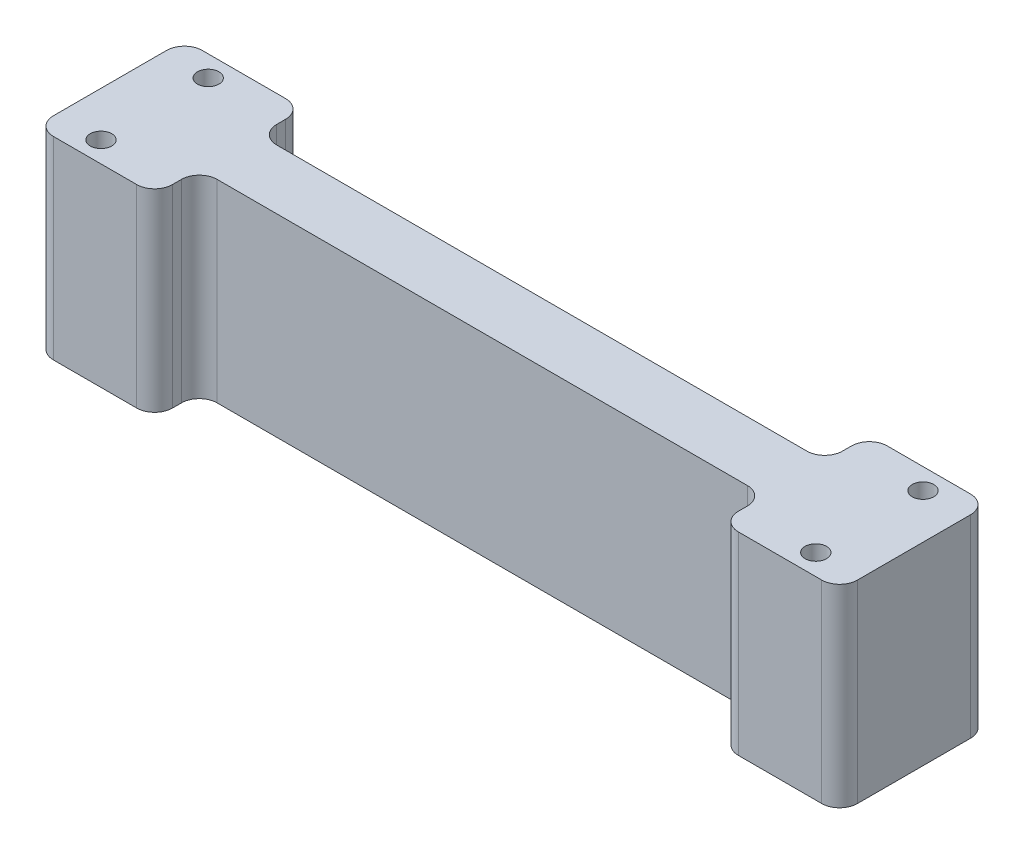
ISO-10303-21;
HEADER;
FILE_DESCRIPTION(('STEP AP214'),'2;1');
FILE_NAME('part.step','',(''),(''),'','','');
FILE_SCHEMA(('AUTOMOTIVE_DESIGN { 1 0 10303 214 1 1 1 1 }'));
ENDSEC;
DATA;
#1=APPLICATION_CONTEXT('core data for automotive mechanical design processes');
#2=APPLICATION_PROTOCOL_DEFINITION('international standard','automotive_design',2000,#1);
#3=PRODUCT_CONTEXT('',#1,'mechanical');
#4=PRODUCT('Part','Part','',(#3));
#5=PRODUCT_RELATED_PRODUCT_CATEGORY('part','',(#4));
#6=PRODUCT_DEFINITION_FORMATION('','',#4);
#7=PRODUCT_DEFINITION_CONTEXT('part definition',#1,'design');
#8=PRODUCT_DEFINITION('design','',#6,#7);
#9=PRODUCT_DEFINITION_SHAPE('','',#8);
#10=(LENGTH_UNIT() NAMED_UNIT(*) SI_UNIT(.MILLI.,.METRE.));
#11=(NAMED_UNIT(*) PLANE_ANGLE_UNIT() SI_UNIT($,.RADIAN.));
#12=(NAMED_UNIT(*) SI_UNIT($,.STERADIAN.) SOLID_ANGLE_UNIT());
#13=UNCERTAINTY_MEASURE_WITH_UNIT(LENGTH_MEASURE(1.E-05),#10,'distance_accuracy_value','');
#14=(GEOMETRIC_REPRESENTATION_CONTEXT(3) GLOBAL_UNCERTAINTY_ASSIGNED_CONTEXT((#13)) GLOBAL_UNIT_ASSIGNED_CONTEXT((#10,
#11,#12)) REPRESENTATION_CONTEXT('',''));
#15=CARTESIAN_POINT('',(0.,0.,0.));
#16=DIRECTION('',(0.,0.,1.));
#17=DIRECTION('',(1.,0.,0.));
#18=AXIS2_PLACEMENT_3D('',#15,#16,#17);
#19=CARTESIAN_POINT('',(47.5,32.5,0.));
#20=DIRECTION('',(-1.,0.,0.));
#21=DIRECTION('',(0.,0.,1.));
#22=AXIS2_PLACEMENT_3D('',#19,#20,#21);
#23=PLANE('',#22);
#24=DIRECTION('',(0.,0.,-1.));
#25=VECTOR('',#24,1.);
#26=CARTESIAN_POINT('',(47.5,0.,0.));
#27=LINE('',#26,#25);
#28=CARTESIAN_POINT('',(47.5,0.,-8.00000000000001));
#29=VERTEX_POINT('',#28);
#30=CARTESIAN_POINT('',(47.5,0.,-9.5));
#31=VERTEX_POINT('',#30);
#32=EDGE_CURVE('E231',#29,#31,#27,.T.);
#33=ORIENTED_EDGE('',*,*,#32,.F.);
#34=DIRECTION('',(0.,-1.,0.));
#35=VECTOR('',#34,1.);
#36=CARTESIAN_POINT('',(47.5,32.5,-8.00000000000001));
#37=LINE('',#36,#35);
#38=CARTESIAN_POINT('',(47.5,32.5,-8.00000000000001));
#39=VERTEX_POINT('',#38);
#40=EDGE_CURVE('E252',#29,#39,#37,.F.);
#41=ORIENTED_EDGE('',*,*,#40,.T.);
#42=DIRECTION('',(0.,0.,-1.));
#43=VECTOR('',#42,1.);
#44=CARTESIAN_POINT('',(47.5,32.5,0.));
#45=LINE('',#44,#43);
#46=CARTESIAN_POINT('',(47.5,32.5,-9.5));
#47=VERTEX_POINT('',#46);
#48=EDGE_CURVE('E498',#39,#47,#45,.T.);
#49=ORIENTED_EDGE('',*,*,#48,.T.);
#50=DIRECTION('',(0.,-1.,0.));
#51=VECTOR('',#50,1.);
#52=CARTESIAN_POINT('',(47.5,32.5,-9.5));
#53=LINE('',#52,#51);
#54=EDGE_CURVE('E239',#47,#31,#53,.T.);
#55=ORIENTED_EDGE('',*,*,#54,.T.);
#56=EDGE_LOOP('',(#33,#41,#49,#55));
#57=FACE_BOUND('',#56,.T.);
#58=ADVANCED_FACE('F50',(#57),#23,.T.);
#59=CARTESIAN_POINT('',(0.,32.5,-5.));
#60=DIRECTION('',(0.,0.,-1.));
#61=DIRECTION('',(-1.,0.,0.));
#62=AXIS2_PLACEMENT_3D('',#59,#60,#61);
#63=PLANE('',#62);
#64=DIRECTION('',(1.,0.,0.));
#65=VECTOR('',#64,1.);
#66=CARTESIAN_POINT('',(0.,32.5,-5.));
#67=LINE('',#66,#65);
#68=CARTESIAN_POINT('',(-44.5,32.5,-5.));
#69=VERTEX_POINT('',#68);
#70=CARTESIAN_POINT('',(44.5,32.5,-5.00000000000001));
#71=VERTEX_POINT('',#70);
#72=EDGE_CURVE('E500',#69,#71,#67,.T.);
#73=ORIENTED_EDGE('',*,*,#72,.T.);
#74=DIRECTION('',(0.,-1.,0.));
#75=VECTOR('',#74,1.);
#76=CARTESIAN_POINT('',(44.5,0.,-5.00000000000001));
#77=LINE('',#76,#75);
#78=CARTESIAN_POINT('',(44.5,0.,-5.00000000000001));
#79=VERTEX_POINT('',#78);
#80=EDGE_CURVE('E228',#71,#79,#77,.T.);
#81=ORIENTED_EDGE('',*,*,#80,.T.);
#82=DIRECTION('',(1.,0.,0.));
#83=VECTOR('',#82,1.);
#84=CARTESIAN_POINT('',(0.,0.,-5.));
#85=LINE('',#84,#83);
#86=CARTESIAN_POINT('',(-44.5,0.,-5.));
#87=VERTEX_POINT('',#86);
#88=EDGE_CURVE('E213',#87,#79,#85,.T.);
#89=ORIENTED_EDGE('',*,*,#88,.F.);
#90=DIRECTION('',(0.,-1.,0.));
#91=VECTOR('',#90,1.);
#92=CARTESIAN_POINT('',(-44.5,32.5,-5.));
#93=LINE('',#92,#91);
#94=EDGE_CURVE('E226',#87,#69,#93,.F.);
#95=ORIENTED_EDGE('',*,*,#94,.T.);
#96=EDGE_LOOP('',(#73,#81,#89,#95));
#97=FACE_BOUND('',#96,.T.);
#98=ADVANCED_FACE('F223',(#97),#63,.T.);
#99=CARTESIAN_POINT('',(-47.5,32.5,0.));
#100=DIRECTION('',(1.,0.,0.));
#101=DIRECTION('',(0.,0.,-1.));
#102=AXIS2_PLACEMENT_3D('',#99,#100,#101);
#103=PLANE('',#102);
#104=DIRECTION('',(0.,0.,1.));
#105=VECTOR('',#104,1.);
#106=CARTESIAN_POINT('',(-47.5,0.,0.));
#107=LINE('',#106,#105);
#108=CARTESIAN_POINT('',(-47.5,0.,-9.5));
#109=VERTEX_POINT('',#108);
#110=CARTESIAN_POINT('',(-47.5,0.,-7.99999999999999));
#111=VERTEX_POINT('',#110);
#112=EDGE_CURVE('E214',#109,#111,#107,.T.);
#113=ORIENTED_EDGE('',*,*,#112,.F.);
#114=DIRECTION('',(0.,-1.,0.));
#115=VECTOR('',#114,1.);
#116=CARTESIAN_POINT('',(-47.5,32.5,-9.5));
#117=LINE('',#116,#115);
#118=CARTESIAN_POINT('',(-47.5,32.5,-9.5));
#119=VERTEX_POINT('',#118);
#120=EDGE_CURVE('E370',#109,#119,#117,.F.);
#121=ORIENTED_EDGE('',*,*,#120,.T.);
#122=DIRECTION('',(0.,0.,1.));
#123=VECTOR('',#122,1.);
#124=CARTESIAN_POINT('',(-47.5,32.5,0.));
#125=LINE('',#124,#123);
#126=CARTESIAN_POINT('',(-47.5,32.5,-7.99999999999999));
#127=VERTEX_POINT('',#126);
#128=EDGE_CURVE('E492',#119,#127,#125,.T.);
#129=ORIENTED_EDGE('',*,*,#128,.T.);
#130=DIRECTION('',(0.,-1.,0.));
#131=VECTOR('',#130,1.);
#132=CARTESIAN_POINT('',(-47.5,0.,-7.99999999999999));
#133=LINE('',#132,#131);
#134=EDGE_CURVE('E365',#127,#111,#133,.T.);
#135=ORIENTED_EDGE('',*,*,#134,.T.);
#136=EDGE_LOOP('',(#113,#121,#129,#135));
#137=FACE_BOUND('',#136,.T.);
#138=ADVANCED_FACE('F553',(#137),#103,.T.);
#139=CARTESIAN_POINT('',(0.,32.5,-12.5));
#140=DIRECTION('',(0.,0.,-1.));
#141=DIRECTION('',(-1.,0.,0.));
#142=AXIS2_PLACEMENT_3D('',#139,#140,#141);
#143=PLANE('',#142);
#144=DIRECTION('',(1.,0.,0.));
#145=VECTOR('',#144,1.);
#146=CARTESIAN_POINT('',(0.,0.,-12.5));
#147=LINE('',#146,#145);
#148=CARTESIAN_POINT('',(-64.5,0.,-12.5));
#149=VERTEX_POINT('',#148);
#150=CARTESIAN_POINT('',(-50.5,0.,-12.5));
#151=VERTEX_POINT('',#150);
#152=EDGE_CURVE('E441',#149,#151,#147,.T.);
#153=ORIENTED_EDGE('',*,*,#152,.F.);
#154=DIRECTION('',(0.,-1.,0.));
#155=VECTOR('',#154,1.);
#156=CARTESIAN_POINT('',(-64.5,32.5,-12.5));
#157=LINE('',#156,#155);
#158=CARTESIAN_POINT('',(-64.5,32.5,-12.5));
#159=VERTEX_POINT('',#158);
#160=EDGE_CURVE('E353',#149,#159,#157,.F.);
#161=ORIENTED_EDGE('',*,*,#160,.T.);
#162=DIRECTION('',(1.,0.,0.));
#163=VECTOR('',#162,1.);
#164=CARTESIAN_POINT('',(0.,32.5,-12.5));
#165=LINE('',#164,#163);
#166=CARTESIAN_POINT('',(-50.5,32.5,-12.5));
#167=VERTEX_POINT('',#166);
#168=EDGE_CURVE('E243',#159,#167,#165,.T.);
#169=ORIENTED_EDGE('',*,*,#168,.T.);
#170=DIRECTION('',(0.,-1.,0.));
#171=VECTOR('',#170,1.);
#172=CARTESIAN_POINT('',(-50.5,32.5,-12.5));
#173=LINE('',#172,#171);
#174=EDGE_CURVE('E348',#167,#151,#173,.T.);
#175=ORIENTED_EDGE('',*,*,#174,.T.);
#176=EDGE_LOOP('',(#153,#161,#169,#175));
#177=FACE_BOUND('',#176,.T.);
#178=ADVANCED_FACE('F614',(#177),#143,.T.);
#179=CARTESIAN_POINT('',(-67.5,32.5,0.));
#180=DIRECTION('',(-1.,0.,0.));
#181=DIRECTION('',(0.,0.,1.));
#182=AXIS2_PLACEMENT_3D('',#179,#180,#181);
#183=PLANE('',#182);
#184=DIRECTION('',(0.,0.,-1.));
#185=VECTOR('',#184,1.);
#186=CARTESIAN_POINT('',(-67.5,0.,0.));
#187=LINE('',#186,#185);
#188=CARTESIAN_POINT('',(-67.5,0.,9.5));
#189=VERTEX_POINT('',#188);
#190=CARTESIAN_POINT('',(-67.5,0.,-9.5));
#191=VERTEX_POINT('',#190);
#192=EDGE_CURVE('E421',#189,#191,#187,.T.);
#193=ORIENTED_EDGE('',*,*,#192,.F.);
#194=DIRECTION('',(0.,-1.,0.));
#195=VECTOR('',#194,1.);
#196=CARTESIAN_POINT('',(-67.5,32.5,9.5));
#197=LINE('',#196,#195);
#198=CARTESIAN_POINT('',(-67.5,32.5,9.5));
#199=VERTEX_POINT('',#198);
#200=EDGE_CURVE('E350',#189,#199,#197,.F.);
#201=ORIENTED_EDGE('',*,*,#200,.T.);
#202=DIRECTION('',(0.,0.,-1.));
#203=VECTOR('',#202,1.);
#204=CARTESIAN_POINT('',(-67.5,32.5,0.));
#205=LINE('',#204,#203);
#206=CARTESIAN_POINT('',(-67.5,32.5,-9.5));
#207=VERTEX_POINT('',#206);
#208=EDGE_CURVE('E490',#199,#207,#205,.T.);
#209=ORIENTED_EDGE('',*,*,#208,.T.);
#210=DIRECTION('',(0.,-1.,0.));
#211=VECTOR('',#210,1.);
#212=CARTESIAN_POINT('',(-67.5,32.5,-9.5));
#213=LINE('',#212,#211);
#214=EDGE_CURVE('E342',#207,#191,#213,.T.);
#215=ORIENTED_EDGE('',*,*,#214,.T.);
#216=EDGE_LOOP('',(#193,#201,#209,#215));
#217=FACE_BOUND('',#216,.T.);
#218=ADVANCED_FACE('F619',(#217),#183,.T.);
#219=CARTESIAN_POINT('',(0.,32.5,12.5));
#220=DIRECTION('',(0.,0.,-1.));
#221=DIRECTION('',(-1.,0.,0.));
#222=AXIS2_PLACEMENT_3D('',#219,#220,#221);
#223=PLANE('',#222);
#224=DIRECTION('',(1.,0.,0.));
#225=VECTOR('',#224,1.);
#226=CARTESIAN_POINT('',(0.,32.5,12.5));
#227=LINE('',#226,#225);
#228=CARTESIAN_POINT('',(-64.5,32.5,12.5));
#229=VERTEX_POINT('',#228);
#230=CARTESIAN_POINT('',(-50.5,32.5,12.5));
#231=VERTEX_POINT('',#230);
#232=EDGE_CURVE('E482',#229,#231,#227,.T.);
#233=ORIENTED_EDGE('',*,*,#232,.F.);
#234=DIRECTION('',(0.,-1.,0.));
#235=VECTOR('',#234,1.);
#236=CARTESIAN_POINT('',(-64.5,0.,12.5));
#237=LINE('',#236,#235);
#238=CARTESIAN_POINT('',(-64.5,0.,12.5));
#239=VERTEX_POINT('',#238);
#240=EDGE_CURVE('E338',#229,#239,#237,.T.);
#241=ORIENTED_EDGE('',*,*,#240,.T.);
#242=DIRECTION('',(1.,0.,0.));
#243=VECTOR('',#242,1.);
#244=CARTESIAN_POINT('',(0.,0.,12.5));
#245=LINE('',#244,#243);
#246=CARTESIAN_POINT('',(-50.5,0.,12.5));
#247=VERTEX_POINT('',#246);
#248=EDGE_CURVE('E418',#239,#247,#245,.T.);
#249=ORIENTED_EDGE('',*,*,#248,.T.);
#250=DIRECTION('',(0.,-1.,0.));
#251=VECTOR('',#250,1.);
#252=CARTESIAN_POINT('',(-50.5,32.5,12.5));
#253=LINE('',#252,#251);
#254=EDGE_CURVE('E336',#247,#231,#253,.F.);
#255=ORIENTED_EDGE('',*,*,#254,.T.);
#256=EDGE_LOOP('',(#233,#241,#249,#255));
#257=FACE_BOUND('',#256,.T.);
#258=ADVANCED_FACE('F627',(#257),#223,.F.);
#259=CARTESIAN_POINT('',(-47.5,32.5,0.));
#260=DIRECTION('',(-1.,0.,0.));
#261=DIRECTION('',(0.,0.,1.));
#262=AXIS2_PLACEMENT_3D('',#259,#260,#261);
#263=PLANE('',#262);
#264=DIRECTION('',(0.,0.,-1.));
#265=VECTOR('',#264,1.);
#266=CARTESIAN_POINT('',(-47.5,32.5,0.));
#267=LINE('',#266,#265);
#268=CARTESIAN_POINT('',(-47.5,32.5,9.5));
#269=VERTEX_POINT('',#268);
#270=CARTESIAN_POINT('',(-47.5,32.5,8.00000000000001));
#271=VERTEX_POINT('',#270);
#272=EDGE_CURVE('E395',#269,#271,#267,.T.);
#273=ORIENTED_EDGE('',*,*,#272,.F.);
#274=DIRECTION('',(0.,-1.,0.));
#275=VECTOR('',#274,1.);
#276=CARTESIAN_POINT('',(-47.5,32.5,9.5));
#277=LINE('',#276,#275);
#278=CARTESIAN_POINT('',(-47.5,0.,9.5));
#279=VERTEX_POINT('',#278);
#280=EDGE_CURVE('E359',#269,#279,#277,.T.);
#281=ORIENTED_EDGE('',*,*,#280,.T.);
#282=DIRECTION('',(0.,0.,-1.));
#283=VECTOR('',#282,1.);
#284=CARTESIAN_POINT('',(-47.5,0.,0.));
#285=LINE('',#284,#283);
#286=CARTESIAN_POINT('',(-47.5,0.,8.00000000000001));
#287=VERTEX_POINT('',#286);
#288=EDGE_CURVE('E410',#279,#287,#285,.T.);
#289=ORIENTED_EDGE('',*,*,#288,.T.);
#290=DIRECTION('',(0.,-1.,0.));
#291=VECTOR('',#290,1.);
#292=CARTESIAN_POINT('',(-47.5,32.5,8.00000000000001));
#293=LINE('',#292,#291);
#294=EDGE_CURVE('E360',#287,#271,#293,.F.);
#295=ORIENTED_EDGE('',*,*,#294,.T.);
#296=EDGE_LOOP('',(#273,#281,#289,#295));
#297=FACE_BOUND('',#296,.T.);
#298=ADVANCED_FACE('F412',(#297),#263,.F.);
#299=CARTESIAN_POINT('',(0.,32.5,5.));
#300=DIRECTION('',(0.,0.,-1.));
#301=DIRECTION('',(-1.,0.,0.));
#302=AXIS2_PLACEMENT_3D('',#299,#300,#301);
#303=PLANE('',#302);
#304=DIRECTION('',(1.,0.,0.));
#305=VECTOR('',#304,1.);
#306=CARTESIAN_POINT('',(0.,0.,5.));
#307=LINE('',#306,#305);
#308=CARTESIAN_POINT('',(-44.5,0.,5.));
#309=VERTEX_POINT('',#308);
#310=CARTESIAN_POINT('',(44.5,0.,4.99999999999999));
#311=VERTEX_POINT('',#310);
#312=EDGE_CURVE('E411',#309,#311,#307,.T.);
#313=ORIENTED_EDGE('',*,*,#312,.T.);
#314=DIRECTION('',(0.,-1.,0.));
#315=VECTOR('',#314,1.);
#316=CARTESIAN_POINT('',(44.5,32.5,4.99999999999999));
#317=LINE('',#316,#315);
#318=CARTESIAN_POINT('',(44.5,32.5,4.99999999999999));
#319=VERTEX_POINT('',#318);
#320=EDGE_CURVE('E334',#311,#319,#317,.F.);
#321=ORIENTED_EDGE('',*,*,#320,.T.);
#322=DIRECTION('',(1.,0.,0.));
#323=VECTOR('',#322,1.);
#324=CARTESIAN_POINT('',(0.,32.5,5.));
#325=LINE('',#324,#323);
#326=CARTESIAN_POINT('',(-44.5,32.5,5.));
#327=VERTEX_POINT('',#326);
#328=EDGE_CURVE('E392',#327,#319,#325,.T.);
#329=ORIENTED_EDGE('',*,*,#328,.F.);
#330=DIRECTION('',(0.,-1.,0.));
#331=VECTOR('',#330,1.);
#332=CARTESIAN_POINT('',(-44.5,0.,5.));
#333=LINE('',#332,#331);
#334=EDGE_CURVE('E328',#327,#309,#333,.T.);
#335=ORIENTED_EDGE('',*,*,#334,.T.);
#336=EDGE_LOOP('',(#313,#321,#329,#335));
#337=FACE_BOUND('',#336,.T.);
#338=ADVANCED_FACE('F402',(#337),#303,.F.);
#339=CARTESIAN_POINT('',(47.5,32.5,0.));
#340=DIRECTION('',(1.,0.,0.));
#341=DIRECTION('',(0.,0.,-1.));
#342=AXIS2_PLACEMENT_3D('',#339,#340,#341);
#343=PLANE('',#342);
#344=DIRECTION('',(0.,0.,1.));
#345=VECTOR('',#344,1.);
#346=CARTESIAN_POINT('',(47.5,0.,0.));
#347=LINE('',#346,#345);
#348=CARTESIAN_POINT('',(47.5,0.,7.99999999999999));
#349=VERTEX_POINT('',#348);
#350=CARTESIAN_POINT('',(47.5,0.,9.5));
#351=VERTEX_POINT('',#350);
#352=EDGE_CURVE('E419',#349,#351,#347,.T.);
#353=ORIENTED_EDGE('',*,*,#352,.T.);
#354=DIRECTION('',(0.,-1.,0.));
#355=VECTOR('',#354,1.);
#356=CARTESIAN_POINT('',(47.5,32.5,9.5));
#357=LINE('',#356,#355);
#358=CARTESIAN_POINT('',(47.5,32.5,9.5));
#359=VERTEX_POINT('',#358);
#360=EDGE_CURVE('E326',#351,#359,#357,.F.);
#361=ORIENTED_EDGE('',*,*,#360,.T.);
#362=DIRECTION('',(0.,0.,1.));
#363=VECTOR('',#362,1.);
#364=CARTESIAN_POINT('',(47.5,32.5,0.));
#365=LINE('',#364,#363);
#366=CARTESIAN_POINT('',(47.5,32.5,7.99999999999999));
#367=VERTEX_POINT('',#366);
#368=EDGE_CURVE('E403',#367,#359,#365,.T.);
#369=ORIENTED_EDGE('',*,*,#368,.F.);
#370=DIRECTION('',(0.,-1.,0.));
#371=VECTOR('',#370,1.);
#372=CARTESIAN_POINT('',(47.5,0.,7.99999999999999));
#373=LINE('',#372,#371);
#374=EDGE_CURVE('E325',#367,#349,#373,.T.);
#375=ORIENTED_EDGE('',*,*,#374,.T.);
#376=EDGE_LOOP('',(#353,#361,#369,#375));
#377=FACE_BOUND('',#376,.T.);
#378=ADVANCED_FACE('F641',(#377),#343,.F.);
#379=CARTESIAN_POINT('',(50.5,0.,12.5));
#380=VERTEX_POINT('',#379);
#381=CARTESIAN_POINT('',(64.5,0.,12.5));
#382=VERTEX_POINT('',#381);
#383=EDGE_CURVE('E422',#380,#382,#245,.T.);
#384=ORIENTED_EDGE('',*,*,#383,.T.);
#385=DIRECTION('',(0.,-1.,0.));
#386=VECTOR('',#385,1.);
#387=CARTESIAN_POINT('',(64.5,32.5,12.5));
#388=LINE('',#387,#386);
#389=CARTESIAN_POINT('',(64.5,32.5,12.5));
#390=VERTEX_POINT('',#389);
#391=EDGE_CURVE('E317',#382,#390,#388,.F.);
#392=ORIENTED_EDGE('',*,*,#391,.T.);
#393=CARTESIAN_POINT('',(50.5,32.5,12.5));
#394=VERTEX_POINT('',#393);
#395=EDGE_CURVE('E476',#394,#390,#227,.T.);
#396=ORIENTED_EDGE('',*,*,#395,.F.);
#397=DIRECTION('',(0.,-1.,0.));
#398=VECTOR('',#397,1.);
#399=CARTESIAN_POINT('',(50.5,32.5,12.5));
#400=LINE('',#399,#398);
#401=EDGE_CURVE('E312',#394,#380,#400,.T.);
#402=ORIENTED_EDGE('',*,*,#401,.T.);
#403=EDGE_LOOP('',(#384,#392,#396,#402));
#404=FACE_BOUND('',#403,.T.);
#405=ADVANCED_FACE('F632',(#404),#223,.F.);
#406=CARTESIAN_POINT('',(67.5,32.5,0.));
#407=DIRECTION('',(-1.,0.,0.));
#408=DIRECTION('',(0.,0.,1.));
#409=AXIS2_PLACEMENT_3D('',#406,#407,#408);
#410=PLANE('',#409);
#411=DIRECTION('',(0.,0.,-1.));
#412=VECTOR('',#411,1.);
#413=CARTESIAN_POINT('',(67.5,0.,0.));
#414=LINE('',#413,#412);
#415=CARTESIAN_POINT('',(67.5,0.,9.5));
#416=VERTEX_POINT('',#415);
#417=CARTESIAN_POINT('',(67.5,0.,-9.5));
#418=VERTEX_POINT('',#417);
#419=EDGE_CURVE('E246',#416,#418,#414,.T.);
#420=ORIENTED_EDGE('',*,*,#419,.T.);
#421=DIRECTION('',(0.,-1.,0.));
#422=VECTOR('',#421,1.);
#423=CARTESIAN_POINT('',(67.5,32.5,-9.5));
#424=LINE('',#423,#422);
#425=CARTESIAN_POINT('',(67.5,32.5,-9.5));
#426=VERTEX_POINT('',#425);
#427=EDGE_CURVE('E64',#418,#426,#424,.F.);
#428=ORIENTED_EDGE('',*,*,#427,.T.);
#429=DIRECTION('',(0.,0.,-1.));
#430=VECTOR('',#429,1.);
#431=CARTESIAN_POINT('',(67.5,32.5,0.));
#432=LINE('',#431,#430);
#433=CARTESIAN_POINT('',(67.5,32.5,9.5));
#434=VERTEX_POINT('',#433);
#435=EDGE_CURVE('E242',#434,#426,#432,.T.);
#436=ORIENTED_EDGE('',*,*,#435,.F.);
#437=DIRECTION('',(0.,-1.,0.));
#438=VECTOR('',#437,1.);
#439=CARTESIAN_POINT('',(67.5,32.5,9.5));
#440=LINE('',#439,#438);
#441=EDGE_CURVE('E310',#434,#416,#440,.T.);
#442=ORIENTED_EDGE('',*,*,#441,.T.);
#443=EDGE_LOOP('',(#420,#428,#436,#442));
#444=FACE_BOUND('',#443,.T.);
#445=ADVANCED_FACE('F535',(#444),#410,.F.);
#446=CARTESIAN_POINT('',(59.9999999999999,32.5,-9.00000000000042));
#447=DIRECTION('',(0.,-1.,0.));
#448=DIRECTION('',(0.,0.,-1.));
#449=AXIS2_PLACEMENT_3D('',#446,#447,#448);
#450=CYLINDRICAL_SURFACE('',#449,1.8);
#451=CARTESIAN_POINT('',(59.9999999999999,32.5,-9.00000000000042));
#452=DIRECTION('',(0.,1.,0.));
#453=DIRECTION('',(0.,0.,1.));
#454=AXIS2_PLACEMENT_3D('',#451,#452,#453);
#455=CIRCLE('',#454,1.8);
#456=CARTESIAN_POINT('',(59.9999999999999,32.5,-7.20000000000042));
#457=VERTEX_POINT('',#456);
#458=EDGE_CURVE('E503',#457,#457,#455,.T.);
#459=ORIENTED_EDGE('',*,*,#458,.T.);
#460=EDGE_LOOP('',(#459));
#461=FACE_BOUND('',#460,.T.);
#462=CARTESIAN_POINT('',(59.9999999999999,0.,-9.00000000000042));
#463=DIRECTION('',(0.,1.,0.));
#464=DIRECTION('',(0.,0.,1.));
#465=AXIS2_PLACEMENT_3D('',#462,#463,#464);
#466=CIRCLE('',#465,1.8);
#467=CARTESIAN_POINT('',(59.9999999999999,0.,-7.20000000000042));
#468=VERTEX_POINT('',#467);
#469=EDGE_CURVE('E458',#468,#468,#466,.T.);
#470=ORIENTED_EDGE('',*,*,#469,.F.);
#471=EDGE_LOOP('',(#470));
#472=FACE_BOUND('',#471,.T.);
#473=ADVANCED_FACE('F526',(#461,#472),#450,.F.);
#474=CARTESIAN_POINT('',(-60.0000000000001,32.5,-8.99999999999958));
#475=DIRECTION('',(0.,-1.,0.));
#476=DIRECTION('',(0.,0.,-1.));
#477=AXIS2_PLACEMENT_3D('',#474,#475,#476);
#478=CYLINDRICAL_SURFACE('',#477,1.80000000000001);
#479=CARTESIAN_POINT('',(-60.0000000000001,32.5,-8.99999999999958));
#480=DIRECTION('',(0.,1.,0.));
#481=DIRECTION('',(0.,0.,1.));
#482=AXIS2_PLACEMENT_3D('',#479,#480,#481);
#483=CIRCLE('',#482,1.80000000000001);
#484=CARTESIAN_POINT('',(-60.0000000000001,32.5,-7.19999999999957));
#485=VERTEX_POINT('',#484);
#486=EDGE_CURVE('E507',#485,#485,#483,.T.);
#487=ORIENTED_EDGE('',*,*,#486,.T.);
#488=EDGE_LOOP('',(#487));
#489=FACE_BOUND('',#488,.T.);
#490=CARTESIAN_POINT('',(-60.0000000000001,0.,-8.99999999999958));
#491=DIRECTION('',(0.,1.,0.));
#492=DIRECTION('',(0.,0.,1.));
#493=AXIS2_PLACEMENT_3D('',#490,#491,#492);
#494=CIRCLE('',#493,1.80000000000001);
#495=CARTESIAN_POINT('',(-60.0000000000001,0.,-7.19999999999957));
#496=VERTEX_POINT('',#495);
#497=EDGE_CURVE('E463',#496,#496,#494,.T.);
#498=ORIENTED_EDGE('',*,*,#497,.F.);
#499=EDGE_LOOP('',(#498));
#500=FACE_BOUND('',#499,.T.);
#501=ADVANCED_FACE('F533',(#489,#500),#478,.F.);
#502=CARTESIAN_POINT('',(-59.9999999999999,32.5,9.00000000000042));
#503=DIRECTION('',(0.,-1.,0.));
#504=DIRECTION('',(0.,0.,-1.));
#505=AXIS2_PLACEMENT_3D('',#502,#503,#504);
#506=CYLINDRICAL_SURFACE('',#505,1.80000000000001);
#507=CARTESIAN_POINT('',(-59.9999999999999,32.5,9.00000000000042));
#508=DIRECTION('',(0.,1.,0.));
#509=DIRECTION('',(0.,0.,1.));
#510=AXIS2_PLACEMENT_3D('',#507,#508,#509);
#511=CIRCLE('',#510,1.80000000000001);
#512=CARTESIAN_POINT('',(-59.9999999999999,32.5,10.8000000000004));
#513=VERTEX_POINT('',#512);
#514=EDGE_CURVE('E449',#513,#513,#511,.T.);
#515=ORIENTED_EDGE('',*,*,#514,.T.);
#516=EDGE_LOOP('',(#515));
#517=FACE_BOUND('',#516,.T.);
#518=CARTESIAN_POINT('',(-59.9999999999999,0.,9.00000000000042));
#519=DIRECTION('',(0.,1.,0.));
#520=DIRECTION('',(0.,0.,1.));
#521=AXIS2_PLACEMENT_3D('',#518,#519,#520);
#522=CIRCLE('',#521,1.80000000000001);
#523=CARTESIAN_POINT('',(-59.9999999999999,0.,10.8000000000004));
#524=VERTEX_POINT('',#523);
#525=EDGE_CURVE('E467',#524,#524,#522,.T.);
#526=ORIENTED_EDGE('',*,*,#525,.F.);
#527=EDGE_LOOP('',(#526));
#528=FACE_BOUND('',#527,.T.);
#529=ADVANCED_FACE('F516',(#517,#528),#506,.F.);
#530=CARTESIAN_POINT('',(60.0000000000001,32.5,8.99999999999958));
#531=DIRECTION('',(0.,-1.,0.));
#532=DIRECTION('',(0.,0.,-1.));
#533=AXIS2_PLACEMENT_3D('',#530,#531,#532);
#534=CYLINDRICAL_SURFACE('',#533,1.8);
#535=CARTESIAN_POINT('',(60.0000000000001,32.5,8.99999999999958));
#536=DIRECTION('',(0.,1.,0.));
#537=DIRECTION('',(0.,0.,1.));
#538=AXIS2_PLACEMENT_3D('',#535,#536,#537);
#539=CIRCLE('',#538,1.8);
#540=CARTESIAN_POINT('',(60.0000000000001,32.5,10.7999999999996));
#541=VERTEX_POINT('',#540);
#542=EDGE_CURVE('E445',#541,#541,#539,.T.);
#543=ORIENTED_EDGE('',*,*,#542,.T.);
#544=EDGE_LOOP('',(#543));
#545=FACE_BOUND('',#544,.T.);
#546=CARTESIAN_POINT('',(60.0000000000001,0.,8.99999999999958));
#547=DIRECTION('',(0.,1.,0.));
#548=DIRECTION('',(0.,0.,1.));
#549=AXIS2_PLACEMENT_3D('',#546,#547,#548);
#550=CIRCLE('',#549,1.8);
#551=CARTESIAN_POINT('',(60.0000000000001,0.,10.7999999999996));
#552=VERTEX_POINT('',#551);
#553=EDGE_CURVE('E472',#552,#552,#550,.T.);
#554=ORIENTED_EDGE('',*,*,#553,.F.);
#555=EDGE_LOOP('',(#554));
#556=FACE_BOUND('',#555,.T.);
#557=ADVANCED_FACE('F564',(#545,#556),#534,.F.);
#558=CARTESIAN_POINT('',(50.5,0.,-12.5));
#559=VERTEX_POINT('',#558);
#560=CARTESIAN_POINT('',(64.5,0.,-12.5));
#561=VERTEX_POINT('',#560);
#562=EDGE_CURVE('E437',#559,#561,#147,.T.);
#563=ORIENTED_EDGE('',*,*,#562,.F.);
#564=DIRECTION('',(0.,-1.,0.));
#565=VECTOR('',#564,1.);
#566=CARTESIAN_POINT('',(50.5,32.5,-12.5));
#567=LINE('',#566,#565);
#568=CARTESIAN_POINT('',(50.5,32.5,-12.5));
#569=VERTEX_POINT('',#568);
#570=EDGE_CURVE('E284',#559,#569,#567,.F.);
#571=ORIENTED_EDGE('',*,*,#570,.T.);
#572=CARTESIAN_POINT('',(64.5,32.5,-12.5));
#573=VERTEX_POINT('',#572);
#574=EDGE_CURVE('E234',#569,#573,#165,.T.);
#575=ORIENTED_EDGE('',*,*,#574,.T.);
#576=DIRECTION('',(0.,-1.,0.));
#577=VECTOR('',#576,1.);
#578=CARTESIAN_POINT('',(64.5,0.,-12.5));
#579=LINE('',#578,#577);
#580=EDGE_CURVE('E276',#573,#561,#579,.T.);
#581=ORIENTED_EDGE('',*,*,#580,.T.);
#582=EDGE_LOOP('',(#563,#571,#575,#581));
#583=FACE_BOUND('',#582,.T.);
#584=ADVANCED_FACE('F521',(#583),#143,.T.);
#585=CARTESIAN_POINT('',(0.,32.5,0.));
#586=DIRECTION('',(0.,1.,0.));
#587=DIRECTION('',(0.,0.,1.));
#588=AXIS2_PLACEMENT_3D('',#585,#586,#587);
#589=PLANE('',#588);
#590=ORIENTED_EDGE('',*,*,#542,.F.);
#591=EDGE_LOOP('',(#590));
#592=FACE_BOUND('',#591,.T.);
#593=ORIENTED_EDGE('',*,*,#514,.F.);
#594=EDGE_LOOP('',(#593));
#595=FACE_BOUND('',#594,.T.);
#596=ORIENTED_EDGE('',*,*,#486,.F.);
#597=EDGE_LOOP('',(#596));
#598=FACE_BOUND('',#597,.T.);
#599=ORIENTED_EDGE('',*,*,#458,.F.);
#600=EDGE_LOOP('',(#599));
#601=FACE_BOUND('',#600,.T.);
#602=ORIENTED_EDGE('',*,*,#574,.F.);
#603=CARTESIAN_POINT('',(50.5,32.5,-9.5));
#604=DIRECTION('',(0.,1.,0.));
#605=DIRECTION('',(0.,0.,1.));
#606=AXIS2_PLACEMENT_3D('',#603,#604,#605);
#607=CIRCLE('',#606,3.);
#608=EDGE_CURVE('E308',#569,#47,#607,.T.);
#609=ORIENTED_EDGE('',*,*,#608,.T.);
#610=ORIENTED_EDGE('',*,*,#48,.F.);
#611=CARTESIAN_POINT('',(44.5,32.5,-8.00000000000001));
#612=DIRECTION('',(0.,1.,0.));
#613=DIRECTION('',(0.,0.,1.));
#614=AXIS2_PLACEMENT_3D('',#611,#612,#613);
#615=CIRCLE('',#614,3.);
#616=EDGE_CURVE('E373',#39,#71,#615,.F.);
#617=ORIENTED_EDGE('',*,*,#616,.T.);
#618=ORIENTED_EDGE('',*,*,#72,.F.);
#619=CARTESIAN_POINT('',(-44.5,32.5,-7.99999999999999));
#620=DIRECTION('',(0.,1.,0.));
#621=DIRECTION('',(0.,0.,1.));
#622=AXIS2_PLACEMENT_3D('',#619,#620,#621);
#623=CIRCLE('',#622,3.);
#624=EDGE_CURVE('E11',#69,#127,#623,.F.);
#625=ORIENTED_EDGE('',*,*,#624,.T.);
#626=ORIENTED_EDGE('',*,*,#128,.F.);
#627=CARTESIAN_POINT('',(-50.5,32.5,-9.5));
#628=DIRECTION('',(0.,1.,0.));
#629=DIRECTION('',(0.,0.,1.));
#630=AXIS2_PLACEMENT_3D('',#627,#628,#629);
#631=CIRCLE('',#630,3.);
#632=EDGE_CURVE('E286',#119,#167,#631,.T.);
#633=ORIENTED_EDGE('',*,*,#632,.T.);
#634=ORIENTED_EDGE('',*,*,#168,.F.);
#635=CARTESIAN_POINT('',(-64.5,32.5,-9.5));
#636=DIRECTION('',(0.,1.,0.));
#637=DIRECTION('',(0.,0.,1.));
#638=AXIS2_PLACEMENT_3D('',#635,#636,#637);
#639=CIRCLE('',#638,3.);
#640=EDGE_CURVE('E295',#159,#207,#639,.T.);
#641=ORIENTED_EDGE('',*,*,#640,.T.);
#642=ORIENTED_EDGE('',*,*,#208,.F.);
#643=CARTESIAN_POINT('',(-64.5,32.5,9.5));
#644=DIRECTION('',(0.,1.,0.));
#645=DIRECTION('',(0.,0.,1.));
#646=AXIS2_PLACEMENT_3D('',#643,#644,#645);
#647=CIRCLE('',#646,3.);
#648=EDGE_CURVE('E293',#199,#229,#647,.T.);
#649=ORIENTED_EDGE('',*,*,#648,.T.);
#650=ORIENTED_EDGE('',*,*,#232,.T.);
#651=CARTESIAN_POINT('',(-50.5,32.5,9.5));
#652=DIRECTION('',(0.,1.,0.));
#653=DIRECTION('',(0.,0.,1.));
#654=AXIS2_PLACEMENT_3D('',#651,#652,#653);
#655=CIRCLE('',#654,3.);
#656=EDGE_CURVE('E288',#231,#269,#655,.T.);
#657=ORIENTED_EDGE('',*,*,#656,.T.);
#658=ORIENTED_EDGE('',*,*,#272,.T.);
#659=CARTESIAN_POINT('',(-44.5,32.5,8.00000000000001));
#660=DIRECTION('',(0.,1.,0.));
#661=DIRECTION('',(0.,0.,1.));
#662=AXIS2_PLACEMENT_3D('',#659,#660,#661);
#663=CIRCLE('',#662,3.);
#664=EDGE_CURVE('E222',#271,#327,#663,.F.);
#665=ORIENTED_EDGE('',*,*,#664,.T.);
#666=ORIENTED_EDGE('',*,*,#328,.T.);
#667=CARTESIAN_POINT('',(44.5,32.5,7.99999999999999));
#668=DIRECTION('',(0.,1.,0.));
#669=DIRECTION('',(0.,0.,1.));
#670=AXIS2_PLACEMENT_3D('',#667,#668,#669);
#671=CIRCLE('',#670,3.);
#672=EDGE_CURVE('E377',#319,#367,#671,.F.);
#673=ORIENTED_EDGE('',*,*,#672,.T.);
#674=ORIENTED_EDGE('',*,*,#368,.T.);
#675=CARTESIAN_POINT('',(50.5,32.5,9.5));
#676=DIRECTION('',(0.,1.,0.));
#677=DIRECTION('',(0.,0.,1.));
#678=AXIS2_PLACEMENT_3D('',#675,#676,#677);
#679=CIRCLE('',#678,3.);
#680=EDGE_CURVE('E299',#359,#394,#679,.T.);
#681=ORIENTED_EDGE('',*,*,#680,.T.);
#682=ORIENTED_EDGE('',*,*,#395,.T.);
#683=CARTESIAN_POINT('',(64.5,32.5,9.5));
#684=DIRECTION('',(0.,1.,0.));
#685=DIRECTION('',(0.,0.,1.));
#686=AXIS2_PLACEMENT_3D('',#683,#684,#685);
#687=CIRCLE('',#686,3.);
#688=EDGE_CURVE('E69',#390,#434,#687,.T.);
#689=ORIENTED_EDGE('',*,*,#688,.T.);
#690=ORIENTED_EDGE('',*,*,#435,.T.);
#691=CARTESIAN_POINT('',(64.5,32.5,-9.5));
#692=DIRECTION('',(0.,1.,0.));
#693=DIRECTION('',(0.,0.,1.));
#694=AXIS2_PLACEMENT_3D('',#691,#692,#693);
#695=CIRCLE('',#694,3.);
#696=EDGE_CURVE('E302',#426,#573,#695,.T.);
#697=ORIENTED_EDGE('',*,*,#696,.T.);
#698=EDGE_LOOP('',(#602,#609,#610,#617,#618,#625,#626,#633,#634,#641,#642,#649,#650,#657,#658,
#665,#666,#673,#674,#681,#682,#689,#690,#697));
#699=FACE_BOUND('',#698,.T.);
#700=ADVANCED_FACE('F391',(#592,#595,#598,#601,#699),#589,.T.);
#701=CARTESIAN_POINT('',(0.,0.,0.));
#702=DIRECTION('',(0.,1.,0.));
#703=DIRECTION('',(0.,0.,1.));
#704=AXIS2_PLACEMENT_3D('',#701,#702,#703);
#705=PLANE('',#704);
#706=ORIENTED_EDGE('',*,*,#553,.T.);
#707=EDGE_LOOP('',(#706));
#708=FACE_BOUND('',#707,.T.);
#709=ORIENTED_EDGE('',*,*,#525,.T.);
#710=EDGE_LOOP('',(#709));
#711=FACE_BOUND('',#710,.T.);
#712=ORIENTED_EDGE('',*,*,#497,.T.);
#713=EDGE_LOOP('',(#712));
#714=FACE_BOUND('',#713,.T.);
#715=ORIENTED_EDGE('',*,*,#469,.T.);
#716=EDGE_LOOP('',(#715));
#717=FACE_BOUND('',#716,.T.);
#718=ORIENTED_EDGE('',*,*,#32,.T.);
#719=CARTESIAN_POINT('',(50.5,0.,-9.5));
#720=DIRECTION('',(0.,1.,0.));
#721=DIRECTION('',(0.,0.,1.));
#722=AXIS2_PLACEMENT_3D('',#719,#720,#721);
#723=CIRCLE('',#722,3.);
#724=EDGE_CURVE('E277',#31,#559,#723,.F.);
#725=ORIENTED_EDGE('',*,*,#724,.T.);
#726=ORIENTED_EDGE('',*,*,#562,.T.);
#727=CARTESIAN_POINT('',(64.5,0.,-9.5));
#728=DIRECTION('',(0.,1.,0.));
#729=DIRECTION('',(0.,0.,1.));
#730=AXIS2_PLACEMENT_3D('',#727,#728,#729);
#731=CIRCLE('',#730,3.);
#732=EDGE_CURVE('E272',#561,#418,#731,.F.);
#733=ORIENTED_EDGE('',*,*,#732,.T.);
#734=ORIENTED_EDGE('',*,*,#419,.F.);
#735=CARTESIAN_POINT('',(64.5,0.,9.5));
#736=DIRECTION('',(0.,1.,0.));
#737=DIRECTION('',(0.,0.,1.));
#738=AXIS2_PLACEMENT_3D('',#735,#736,#737);
#739=CIRCLE('',#738,3.);
#740=EDGE_CURVE('E269',#416,#382,#739,.F.);
#741=ORIENTED_EDGE('',*,*,#740,.T.);
#742=ORIENTED_EDGE('',*,*,#383,.F.);
#743=CARTESIAN_POINT('',(50.5,0.,9.5));
#744=DIRECTION('',(0.,1.,0.));
#745=DIRECTION('',(0.,0.,1.));
#746=AXIS2_PLACEMENT_3D('',#743,#744,#745);
#747=CIRCLE('',#746,3.);
#748=EDGE_CURVE('E270',#380,#351,#747,.F.);
#749=ORIENTED_EDGE('',*,*,#748,.T.);
#750=ORIENTED_EDGE('',*,*,#352,.F.);
#751=CARTESIAN_POINT('',(44.5,0.,7.99999999999999));
#752=DIRECTION('',(0.,1.,0.));
#753=DIRECTION('',(0.,0.,1.));
#754=AXIS2_PLACEMENT_3D('',#751,#752,#753);
#755=CIRCLE('',#754,3.);
#756=EDGE_CURVE('E376',#349,#311,#755,.T.);
#757=ORIENTED_EDGE('',*,*,#756,.T.);
#758=ORIENTED_EDGE('',*,*,#312,.F.);
#759=CARTESIAN_POINT('',(-44.5,0.,8.00000000000001));
#760=DIRECTION('',(0.,1.,0.));
#761=DIRECTION('',(0.,0.,1.));
#762=AXIS2_PLACEMENT_3D('',#759,#760,#761);
#763=CIRCLE('',#762,3.);
#764=EDGE_CURVE('E385',#309,#287,#763,.T.);
#765=ORIENTED_EDGE('',*,*,#764,.T.);
#766=ORIENTED_EDGE('',*,*,#288,.F.);
#767=CARTESIAN_POINT('',(-50.5,0.,9.5));
#768=DIRECTION('',(0.,1.,0.));
#769=DIRECTION('',(0.,0.,1.));
#770=AXIS2_PLACEMENT_3D('',#767,#768,#769);
#771=CIRCLE('',#770,3.);
#772=EDGE_CURVE('E256',#279,#247,#771,.F.);
#773=ORIENTED_EDGE('',*,*,#772,.T.);
#774=ORIENTED_EDGE('',*,*,#248,.F.);
#775=CARTESIAN_POINT('',(-64.5,0.,9.5));
#776=DIRECTION('',(0.,1.,0.));
#777=DIRECTION('',(0.,0.,1.));
#778=AXIS2_PLACEMENT_3D('',#775,#776,#777);
#779=CIRCLE('',#778,3.);
#780=EDGE_CURVE('E262',#239,#189,#779,.F.);
#781=ORIENTED_EDGE('',*,*,#780,.T.);
#782=ORIENTED_EDGE('',*,*,#192,.T.);
#783=CARTESIAN_POINT('',(-64.5,0.,-9.5));
#784=DIRECTION('',(0.,1.,0.));
#785=DIRECTION('',(0.,0.,1.));
#786=AXIS2_PLACEMENT_3D('',#783,#784,#785);
#787=CIRCLE('',#786,3.);
#788=EDGE_CURVE('E261',#191,#149,#787,.F.);
#789=ORIENTED_EDGE('',*,*,#788,.T.);
#790=ORIENTED_EDGE('',*,*,#152,.T.);
#791=CARTESIAN_POINT('',(-50.5,0.,-9.5));
#792=DIRECTION('',(0.,1.,0.));
#793=DIRECTION('',(0.,0.,1.));
#794=AXIS2_PLACEMENT_3D('',#791,#792,#793);
#795=CIRCLE('',#794,3.);
#796=EDGE_CURVE('E254',#151,#109,#795,.F.);
#797=ORIENTED_EDGE('',*,*,#796,.T.);
#798=ORIENTED_EDGE('',*,*,#112,.T.);
#799=CARTESIAN_POINT('',(-44.5,0.,-7.99999999999999));
#800=DIRECTION('',(0.,1.,0.));
#801=DIRECTION('',(0.,0.,1.));
#802=AXIS2_PLACEMENT_3D('',#799,#800,#801);
#803=CIRCLE('',#802,3.);
#804=EDGE_CURVE('E57',#111,#87,#803,.T.);
#805=ORIENTED_EDGE('',*,*,#804,.T.);
#806=ORIENTED_EDGE('',*,*,#88,.T.);
#807=CARTESIAN_POINT('',(44.5,0.,-8.00000000000001));
#808=DIRECTION('',(0.,1.,0.));
#809=DIRECTION('',(0.,0.,1.));
#810=AXIS2_PLACEMENT_3D('',#807,#808,#809);
#811=CIRCLE('',#810,3.);
#812=EDGE_CURVE('E367',#79,#29,#811,.T.);
#813=ORIENTED_EDGE('',*,*,#812,.T.);
#814=EDGE_LOOP('',(#718,#725,#726,#733,#734,#741,#742,#749,#750,#757,#758,#765,#766,#773,#774,
#781,#782,#789,#790,#797,#798,#805,#806,#813));
#815=FACE_BOUND('',#814,.T.);
#816=ADVANCED_FACE('F215',(#708,#711,#714,#717,#815),#705,.F.);
#817=CARTESIAN_POINT('',(44.5,32.5,-8.00000000000001));
#818=DIRECTION('',(0.,1.,0.));
#819=DIRECTION('',(0.,0.,1.));
#820=AXIS2_PLACEMENT_3D('',#817,#818,#819);
#821=CYLINDRICAL_SURFACE('',#820,3.);
#822=ORIENTED_EDGE('',*,*,#616,.F.);
#823=ORIENTED_EDGE('',*,*,#40,.F.);
#824=ORIENTED_EDGE('',*,*,#812,.F.);
#825=ORIENTED_EDGE('',*,*,#80,.F.);
#826=EDGE_LOOP('',(#822,#823,#824,#825));
#827=FACE_BOUND('',#826,.T.);
#828=ADVANCED_FACE('F540',(#827),#821,.F.);
#829=CARTESIAN_POINT('',(50.5,32.5,-9.5));
#830=DIRECTION('',(0.,-1.,0.));
#831=DIRECTION('',(0.,0.,-1.));
#832=AXIS2_PLACEMENT_3D('',#829,#830,#831);
#833=CYLINDRICAL_SURFACE('',#832,3.);
#834=ORIENTED_EDGE('',*,*,#608,.F.);
#835=ORIENTED_EDGE('',*,*,#570,.F.);
#836=ORIENTED_EDGE('',*,*,#724,.F.);
#837=ORIENTED_EDGE('',*,*,#54,.F.);
#838=EDGE_LOOP('',(#834,#835,#836,#837));
#839=FACE_BOUND('',#838,.T.);
#840=ADVANCED_FACE('F543',(#839),#833,.T.);
#841=CARTESIAN_POINT('',(64.5,32.5,-9.5));
#842=DIRECTION('',(0.,1.,0.));
#843=DIRECTION('',(0.,0.,1.));
#844=AXIS2_PLACEMENT_3D('',#841,#842,#843);
#845=CYLINDRICAL_SURFACE('',#844,3.);
#846=ORIENTED_EDGE('',*,*,#696,.F.);
#847=ORIENTED_EDGE('',*,*,#427,.F.);
#848=ORIENTED_EDGE('',*,*,#732,.F.);
#849=ORIENTED_EDGE('',*,*,#580,.F.);
#850=EDGE_LOOP('',(#846,#847,#848,#849));
#851=FACE_BOUND('',#850,.T.);
#852=ADVANCED_FACE('F568',(#851),#845,.T.);
#853=CARTESIAN_POINT('',(64.5,32.5,9.5));
#854=DIRECTION('',(0.,-1.,0.));
#855=DIRECTION('',(0.,0.,-1.));
#856=AXIS2_PLACEMENT_3D('',#853,#854,#855);
#857=CYLINDRICAL_SURFACE('',#856,3.);
#858=ORIENTED_EDGE('',*,*,#688,.F.);
#859=ORIENTED_EDGE('',*,*,#391,.F.);
#860=ORIENTED_EDGE('',*,*,#740,.F.);
#861=ORIENTED_EDGE('',*,*,#441,.F.);
#862=EDGE_LOOP('',(#858,#859,#860,#861));
#863=FACE_BOUND('',#862,.T.);
#864=ADVANCED_FACE('F573',(#863),#857,.T.);
#865=CARTESIAN_POINT('',(50.5,32.5,9.5));
#866=DIRECTION('',(0.,-1.,0.));
#867=DIRECTION('',(0.,0.,-1.));
#868=AXIS2_PLACEMENT_3D('',#865,#866,#867);
#869=CYLINDRICAL_SURFACE('',#868,3.);
#870=ORIENTED_EDGE('',*,*,#680,.F.);
#871=ORIENTED_EDGE('',*,*,#360,.F.);
#872=ORIENTED_EDGE('',*,*,#748,.F.);
#873=ORIENTED_EDGE('',*,*,#401,.F.);
#874=EDGE_LOOP('',(#870,#871,#872,#873));
#875=FACE_BOUND('',#874,.T.);
#876=ADVANCED_FACE('F577',(#875),#869,.T.);
#877=CARTESIAN_POINT('',(44.5,32.5,7.99999999999999));
#878=DIRECTION('',(0.,1.,0.));
#879=DIRECTION('',(0.,0.,1.));
#880=AXIS2_PLACEMENT_3D('',#877,#878,#879);
#881=CYLINDRICAL_SURFACE('',#880,3.);
#882=ORIENTED_EDGE('',*,*,#672,.F.);
#883=ORIENTED_EDGE('',*,*,#320,.F.);
#884=ORIENTED_EDGE('',*,*,#756,.F.);
#885=ORIENTED_EDGE('',*,*,#374,.F.);
#886=EDGE_LOOP('',(#882,#883,#884,#885));
#887=FACE_BOUND('',#886,.T.);
#888=ADVANCED_FACE('F582',(#887),#881,.F.);
#889=CARTESIAN_POINT('',(-64.5,32.5,9.5));
#890=DIRECTION('',(0.,1.,0.));
#891=DIRECTION('',(0.,0.,1.));
#892=AXIS2_PLACEMENT_3D('',#889,#890,#891);
#893=CYLINDRICAL_SURFACE('',#892,3.);
#894=ORIENTED_EDGE('',*,*,#648,.F.);
#895=ORIENTED_EDGE('',*,*,#200,.F.);
#896=ORIENTED_EDGE('',*,*,#780,.F.);
#897=ORIENTED_EDGE('',*,*,#240,.F.);
#898=EDGE_LOOP('',(#894,#895,#896,#897));
#899=FACE_BOUND('',#898,.T.);
#900=ADVANCED_FACE('F588',(#899),#893,.T.);
#901=CARTESIAN_POINT('',(-64.5,32.5,-9.5));
#902=DIRECTION('',(0.,-1.,0.));
#903=DIRECTION('',(0.,0.,-1.));
#904=AXIS2_PLACEMENT_3D('',#901,#902,#903);
#905=CYLINDRICAL_SURFACE('',#904,3.);
#906=ORIENTED_EDGE('',*,*,#640,.F.);
#907=ORIENTED_EDGE('',*,*,#160,.F.);
#908=ORIENTED_EDGE('',*,*,#788,.F.);
#909=ORIENTED_EDGE('',*,*,#214,.F.);
#910=EDGE_LOOP('',(#906,#907,#908,#909));
#911=FACE_BOUND('',#910,.T.);
#912=ADVANCED_FACE('F587',(#911),#905,.T.);
#913=CARTESIAN_POINT('',(-50.5,32.5,9.5));
#914=DIRECTION('',(0.,-1.,0.));
#915=DIRECTION('',(0.,0.,-1.));
#916=AXIS2_PLACEMENT_3D('',#913,#914,#915);
#917=CYLINDRICAL_SURFACE('',#916,3.);
#918=ORIENTED_EDGE('',*,*,#656,.F.);
#919=ORIENTED_EDGE('',*,*,#254,.F.);
#920=ORIENTED_EDGE('',*,*,#772,.F.);
#921=ORIENTED_EDGE('',*,*,#280,.F.);
#922=EDGE_LOOP('',(#918,#919,#920,#921));
#923=FACE_BOUND('',#922,.T.);
#924=ADVANCED_FACE('F592',(#923),#917,.T.);
#925=CARTESIAN_POINT('',(-44.5,32.5,8.00000000000001));
#926=DIRECTION('',(0.,1.,0.));
#927=DIRECTION('',(0.,0.,1.));
#928=AXIS2_PLACEMENT_3D('',#925,#926,#927);
#929=CYLINDRICAL_SURFACE('',#928,3.);
#930=ORIENTED_EDGE('',*,*,#664,.F.);
#931=ORIENTED_EDGE('',*,*,#294,.F.);
#932=ORIENTED_EDGE('',*,*,#764,.F.);
#933=ORIENTED_EDGE('',*,*,#334,.F.);
#934=EDGE_LOOP('',(#930,#931,#932,#933));
#935=FACE_BOUND('',#934,.T.);
#936=ADVANCED_FACE('F407',(#935),#929,.F.);
#937=CARTESIAN_POINT('',(-50.5,32.5,-9.5));
#938=DIRECTION('',(0.,-1.,0.));
#939=DIRECTION('',(0.,0.,-1.));
#940=AXIS2_PLACEMENT_3D('',#937,#938,#939);
#941=CYLINDRICAL_SURFACE('',#940,3.);
#942=ORIENTED_EDGE('',*,*,#632,.F.);
#943=ORIENTED_EDGE('',*,*,#120,.F.);
#944=ORIENTED_EDGE('',*,*,#796,.F.);
#945=ORIENTED_EDGE('',*,*,#174,.F.);
#946=EDGE_LOOP('',(#942,#943,#944,#945));
#947=FACE_BOUND('',#946,.T.);
#948=ADVANCED_FACE('F599',(#947),#941,.T.);
#949=CARTESIAN_POINT('',(-44.5,32.5,-7.99999999999999));
#950=DIRECTION('',(0.,1.,0.));
#951=DIRECTION('',(0.,0.,1.));
#952=AXIS2_PLACEMENT_3D('',#949,#950,#951);
#953=CYLINDRICAL_SURFACE('',#952,3.);
#954=ORIENTED_EDGE('',*,*,#624,.F.);
#955=ORIENTED_EDGE('',*,*,#94,.F.);
#956=ORIENTED_EDGE('',*,*,#804,.F.);
#957=ORIENTED_EDGE('',*,*,#134,.F.);
#958=EDGE_LOOP('',(#954,#955,#956,#957));
#959=FACE_BOUND('',#958,.T.);
#960=ADVANCED_FACE('F47',(#959),#953,.F.);
#961=CLOSED_SHELL('',(#58,#98,#138,#178,#218,#258,#298,#338,#378,#405,#445,#473,#501,#529,#557,
#584,#700,#816,#828,#840,#852,#864,#876,#888,#900,#912,#924,#936,#948,#960));
#962=MANIFOLD_SOLID_BREP('B2',#961);
#963=ADVANCED_BREP_SHAPE_REPRESENTATION('',(#18,#962),#14);
#964=SHAPE_DEFINITION_REPRESENTATION(#9,#963);
ENDSEC;
END-ISO-10303-21;
